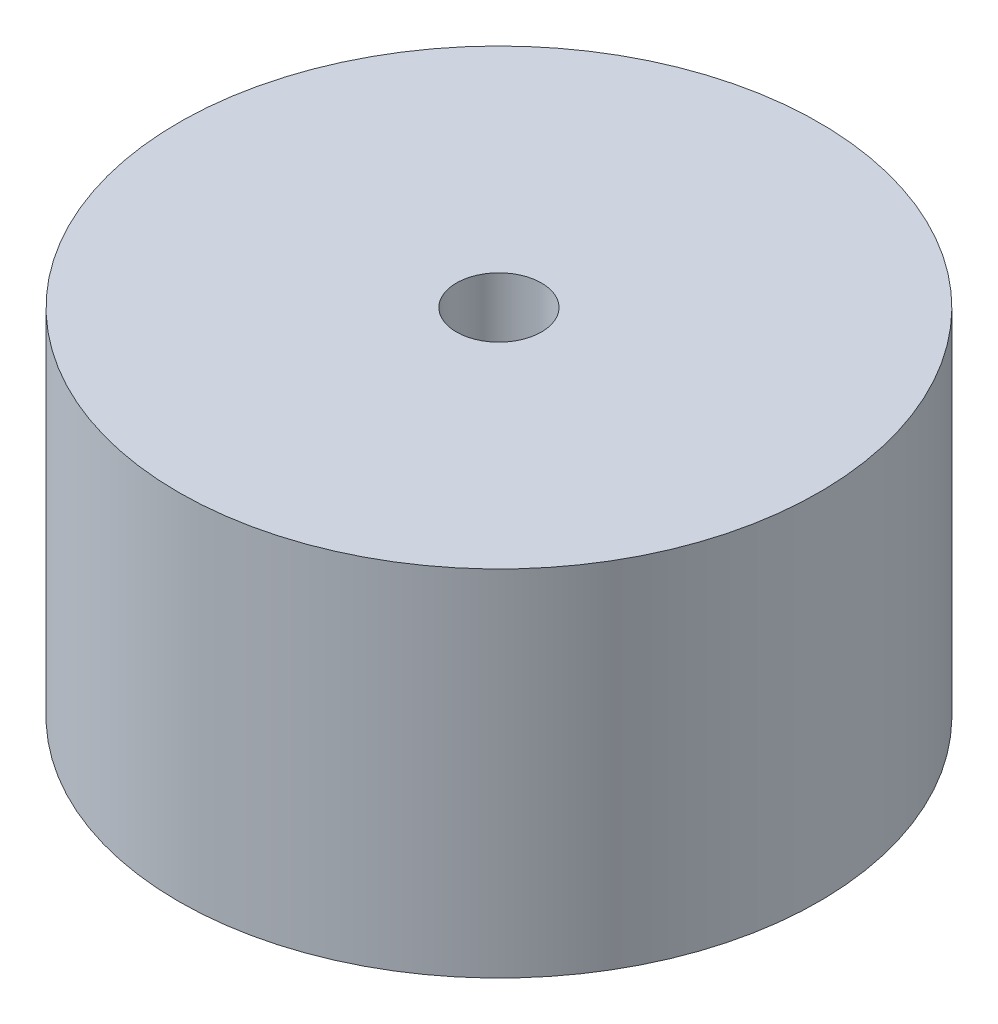
ISO-10303-21;
HEADER;
FILE_DESCRIPTION(('STEP AP214'),'2;1');
FILE_NAME('part.step','',(''),(''),'','','');
FILE_SCHEMA(('AUTOMOTIVE_DESIGN { 1 0 10303 214 1 1 1 1 }'));
ENDSEC;
DATA;
#1=APPLICATION_CONTEXT('core data for automotive mechanical design processes');
#2=APPLICATION_PROTOCOL_DEFINITION('international standard','automotive_design',2000,#1);
#3=PRODUCT_CONTEXT('',#1,'mechanical');
#4=PRODUCT('Part','Part','',(#3));
#5=PRODUCT_RELATED_PRODUCT_CATEGORY('part','',(#4));
#6=PRODUCT_DEFINITION_FORMATION('','',#4);
#7=PRODUCT_DEFINITION_CONTEXT('part definition',#1,'design');
#8=PRODUCT_DEFINITION('design','',#6,#7);
#9=PRODUCT_DEFINITION_SHAPE('','',#8);
#10=(LENGTH_UNIT() NAMED_UNIT(*) SI_UNIT(.MILLI.,.METRE.));
#11=(NAMED_UNIT(*) PLANE_ANGLE_UNIT() SI_UNIT($,.RADIAN.));
#12=(NAMED_UNIT(*) SI_UNIT($,.STERADIAN.) SOLID_ANGLE_UNIT());
#13=UNCERTAINTY_MEASURE_WITH_UNIT(LENGTH_MEASURE(1.E-05),#10,'distance_accuracy_value','');
#14=(GEOMETRIC_REPRESENTATION_CONTEXT(3) GLOBAL_UNCERTAINTY_ASSIGNED_CONTEXT((#13)) GLOBAL_UNIT_ASSIGNED_CONTEXT((#10,
#11,#12)) REPRESENTATION_CONTEXT('',''));
#15=CARTESIAN_POINT('',(0.,0.,0.));
#16=DIRECTION('',(0.,0.,1.));
#17=DIRECTION('',(1.,0.,0.));
#18=AXIS2_PLACEMENT_3D('',#15,#16,#17);
#19=CARTESIAN_POINT('',(0.,15.875,0.));
#20=DIRECTION('',(0.,1.,0.));
#21=DIRECTION('',(0.,0.,1.));
#22=AXIS2_PLACEMENT_3D('',#19,#20,#21);
#23=PLANE('',#22);
#24=CARTESIAN_POINT('',(0.,15.875,0.));
#25=DIRECTION('',(0.,1.,0.));
#26=DIRECTION('',(0.,0.,1.));
#27=AXIS2_PLACEMENT_3D('',#24,#25,#26);
#28=CIRCLE('',#27,14.351);
#29=CARTESIAN_POINT('',(0.,15.875,14.351));
#30=VERTEX_POINT('',#29);
#31=EDGE_CURVE('E10',#30,#30,#28,.T.);
#32=ORIENTED_EDGE('',*,*,#31,.T.);
#33=EDGE_LOOP('',(#32));
#34=FACE_BOUND('',#33,.T.);
#35=CARTESIAN_POINT('',(0.,15.875,0.));
#36=DIRECTION('',(0.,1.,0.));
#37=DIRECTION('',(0.,0.,1.));
#38=AXIS2_PLACEMENT_3D('',#35,#36,#37);
#39=CIRCLE('',#38,1.905);
#40=CARTESIAN_POINT('',(0.,15.875,1.905));
#41=VERTEX_POINT('',#40);
#42=EDGE_CURVE('E50',#41,#41,#39,.T.);
#43=ORIENTED_EDGE('',*,*,#42,.F.);
#44=EDGE_LOOP('',(#43));
#45=FACE_BOUND('',#44,.T.);
#46=ADVANCED_FACE('F37',(#34,#45),#23,.T.);
#47=CARTESIAN_POINT('',(0.,0.,0.));
#48=DIRECTION('',(0.,1.,0.));
#49=DIRECTION('',(0.,0.,1.));
#50=AXIS2_PLACEMENT_3D('',#47,#48,#49);
#51=PLANE('',#50);
#52=CARTESIAN_POINT('',(0.,0.,0.));
#53=DIRECTION('',(0.,1.,0.));
#54=DIRECTION('',(0.,0.,1.));
#55=AXIS2_PLACEMENT_3D('',#52,#53,#54);
#56=CIRCLE('',#55,14.351);
#57=CARTESIAN_POINT('',(0.,0.,14.351));
#58=VERTEX_POINT('',#57);
#59=EDGE_CURVE('E41',#58,#58,#56,.T.);
#60=ORIENTED_EDGE('',*,*,#59,.F.);
#61=EDGE_LOOP('',(#60));
#62=FACE_BOUND('',#61,.T.);
#63=CARTESIAN_POINT('',(0.,0.,0.));
#64=DIRECTION('',(0.,1.,0.));
#65=DIRECTION('',(0.,0.,1.));
#66=AXIS2_PLACEMENT_3D('',#63,#64,#65);
#67=CIRCLE('',#66,1.905);
#68=CARTESIAN_POINT('',(0.,0.,1.905));
#69=VERTEX_POINT('',#68);
#70=EDGE_CURVE('E52',#69,#69,#67,.T.);
#71=ORIENTED_EDGE('',*,*,#70,.T.);
#72=EDGE_LOOP('',(#71));
#73=FACE_BOUND('',#72,.T.);
#74=ADVANCED_FACE('F64',(#62,#73),#51,.F.);
#75=CARTESIAN_POINT('',(0.,15.875,0.));
#76=DIRECTION('',(0.,-1.,0.));
#77=DIRECTION('',(0.,0.,-1.));
#78=AXIS2_PLACEMENT_3D('',#75,#76,#77);
#79=CYLINDRICAL_SURFACE('',#78,14.351);
#80=ORIENTED_EDGE('',*,*,#31,.F.);
#81=EDGE_LOOP('',(#80));
#82=FACE_BOUND('',#81,.T.);
#83=ORIENTED_EDGE('',*,*,#59,.T.);
#84=EDGE_LOOP('',(#83));
#85=FACE_BOUND('',#84,.T.);
#86=ADVANCED_FACE('F39',(#82,#85),#79,.T.);
#87=CARTESIAN_POINT('',(0.,15.875,0.));
#88=DIRECTION('',(0.,-1.,0.));
#89=DIRECTION('',(0.,0.,-1.));
#90=AXIS2_PLACEMENT_3D('',#87,#88,#89);
#91=CYLINDRICAL_SURFACE('',#90,1.905);
#92=ORIENTED_EDGE('',*,*,#42,.T.);
#93=EDGE_LOOP('',(#92));
#94=FACE_BOUND('',#93,.T.);
#95=ORIENTED_EDGE('',*,*,#70,.F.);
#96=EDGE_LOOP('',(#95));
#97=FACE_BOUND('',#96,.T.);
#98=ADVANCED_FACE('F60',(#94,#97),#91,.F.);
#99=CLOSED_SHELL('',(#46,#74,#86,#98));
#100=MANIFOLD_SOLID_BREP('B2',#99);
#101=ADVANCED_BREP_SHAPE_REPRESENTATION('',(#18,#100),#14);
#102=SHAPE_DEFINITION_REPRESENTATION(#9,#101);
ENDSEC;
END-ISO-10303-21;
